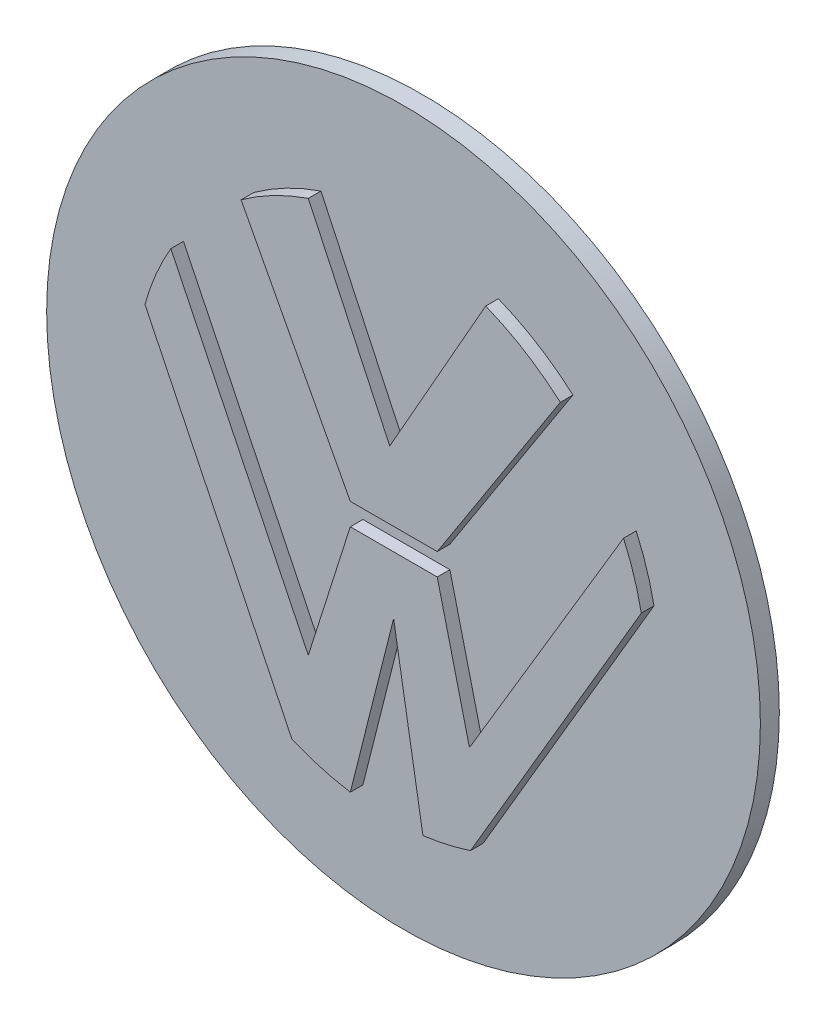
ISO-10303-21;
HEADER;
FILE_DESCRIPTION(('STEP AP214'),'2;1');
FILE_NAME('part.step','',(''),(''),'','','');
FILE_SCHEMA(('AUTOMOTIVE_DESIGN { 1 0 10303 214 1 1 1 1 }'));
ENDSEC;
DATA;
#1=APPLICATION_CONTEXT('core data for automotive mechanical design processes');
#2=APPLICATION_PROTOCOL_DEFINITION('international standard','automotive_design',2000,#1);
#3=PRODUCT_CONTEXT('',#1,'mechanical');
#4=PRODUCT('Part','Part','',(#3));
#5=PRODUCT_RELATED_PRODUCT_CATEGORY('part','',(#4));
#6=PRODUCT_DEFINITION_FORMATION('','',#4);
#7=PRODUCT_DEFINITION_CONTEXT('part definition',#1,'design');
#8=PRODUCT_DEFINITION('design','',#6,#7);
#9=PRODUCT_DEFINITION_SHAPE('','',#8);
#10=(LENGTH_UNIT() NAMED_UNIT(*) SI_UNIT(.MILLI.,.METRE.));
#11=(NAMED_UNIT(*) PLANE_ANGLE_UNIT() SI_UNIT($,.RADIAN.));
#12=(NAMED_UNIT(*) SI_UNIT($,.STERADIAN.) SOLID_ANGLE_UNIT());
#13=UNCERTAINTY_MEASURE_WITH_UNIT(LENGTH_MEASURE(1.E-05),#10,'distance_accuracy_value','');
#14=(GEOMETRIC_REPRESENTATION_CONTEXT(3) GLOBAL_UNCERTAINTY_ASSIGNED_CONTEXT((#13)) GLOBAL_UNIT_ASSIGNED_CONTEXT((#10,
#11,#12)) REPRESENTATION_CONTEXT('',''));
#15=CARTESIAN_POINT('',(0.,0.,0.));
#16=DIRECTION('',(0.,0.,1.));
#17=DIRECTION('',(1.,0.,0.));
#18=AXIS2_PLACEMENT_3D('',#15,#16,#17);
#19=CARTESIAN_POINT('',(0.,0.,3.81));
#20=DIRECTION('',(0.,0.,1.));
#21=DIRECTION('',(1.,0.,0.));
#22=AXIS2_PLACEMENT_3D('',#19,#20,#21);
#23=PLANE('',#22);
#24=CARTESIAN_POINT('',(0.,0.,3.81));
#25=DIRECTION('',(0.,0.,1.));
#26=DIRECTION('',(1.,0.,0.));
#27=AXIS2_PLACEMENT_3D('',#24,#25,#26);
#28=CIRCLE('',#27,51.2536647636642);
#29=CARTESIAN_POINT('',(34.0363055297971,38.320595736345,3.81));
#30=VERTEX_POINT('',#29);
#31=CARTESIAN_POINT('',(19.0523443786856,47.5809449820203,3.81));
#32=VERTEX_POINT('',#31);
#33=EDGE_CURVE('E12',#30,#32,#28,.T.);
#34=ORIENTED_EDGE('',*,*,#33,.F.);
#35=DIRECTION('',(0.5420922449111,0.840318985866227,0.));
#36=VECTOR('',#35,1.);
#37=CARTESIAN_POINT('',(6.5780640593809,-4.24352843752894,3.81));
#38=LINE('',#37,#36);
#39=CARTESIAN_POINT('',(9.31557671318919,0.,3.81));
#40=VERTEX_POINT('',#39);
#41=EDGE_CURVE('E273',#40,#30,#38,.T.);
#42=ORIENTED_EDGE('',*,*,#41,.F.);
#43=DIRECTION('',(1.,0.,0.));
#44=VECTOR('',#43,1.);
#45=CARTESIAN_POINT('',(0.,0.,3.81));
#46=LINE('',#45,#44);
#47=CARTESIAN_POINT('',(-8.15112962404055,0.,3.81));
#48=VERTEX_POINT('',#47);
#49=EDGE_CURVE('E110',#48,#40,#46,.T.);
#50=ORIENTED_EDGE('',*,*,#49,.F.);
#51=DIRECTION('',(0.467462243657378,-0.884013037661103,0.));
#52=VECTOR('',#51,1.);
#53=CARTESIAN_POINT('',(-6.36993704117462,-3.36839496066942,3.81));
#54=LINE('',#53,#52);
#55=CARTESIAN_POINT('',(-30.0911287040771,41.4905064444958,3.81));
#56=VERTEX_POINT('',#55);
#57=EDGE_CURVE('E118',#56,#48,#54,.T.);
#58=ORIENTED_EDGE('',*,*,#57,.F.);
#59=CARTESIAN_POINT('',(0.,0.,3.81));
#60=DIRECTION('',(0.,0.,1.));
#61=DIRECTION('',(1.,0.,0.));
#62=AXIS2_PLACEMENT_3D('',#59,#60,#61);
#63=CIRCLE('',#62,51.2536647636642);
#64=CARTESIAN_POINT('',(-16.5902934966743,48.4943327967329,3.81));
#65=VERTEX_POINT('',#64);
#66=EDGE_CURVE('E103',#56,#65,#63,.F.);
#67=ORIENTED_EDGE('',*,*,#66,.T.);
#68=DIRECTION('',(-0.424472625867111,0.905440771055445,0.));
#69=VECTOR('',#68,1.);
#70=CARTESIAN_POINT('',(5.03695672922229,2.36133639833751,3.81));
#71=LINE('',#70,#69);
#72=CARTESIAN_POINT('',(-0.226270451346261,13.5883041371379,3.81));
#73=VERTEX_POINT('',#72);
#74=EDGE_CURVE('E269',#73,#65,#71,.T.);
#75=ORIENTED_EDGE('',*,*,#74,.F.);
#76=DIRECTION('',(0.493324744152342,0.869845214280694,0.));
#77=VECTOR('',#76,1.);
#78=CARTESIAN_POINT('',(-6.00216416732404,3.40407241839464,3.81));
#79=LINE('',#78,#77);
#80=EDGE_CURVE('E271',#73,#32,#79,.T.);
#81=ORIENTED_EDGE('',*,*,#80,.T.);
#82=EDGE_LOOP('',(#34,#42,#50,#58,#67,#75,#81));
#83=FACE_BOUND('',#82,.T.);
#84=DIRECTION('',(-0.512164792370812,-0.858887201823245,0.));
#85=VECTOR('',#84,1.);
#86=CARTESIAN_POINT('',(25.2268894986552,-15.0430983193287,3.81));
#87=LINE('',#86,#85);
#88=CARTESIAN_POINT('',(46.739319117021,21.0326936026595,3.81));
#89=VERTEX_POINT('',#88);
#90=CARTESIAN_POINT('',(15.7846686376129,-30.8774601793024,3.81));
#91=VERTEX_POINT('',#90);
#92=EDGE_CURVE('E261',#89,#91,#87,.T.);
#93=ORIENTED_EDGE('',*,*,#92,.F.);
#94=CARTESIAN_POINT('',(0.,0.,3.81));
#95=DIRECTION('',(0.,0.,1.));
#96=DIRECTION('',(1.,0.,0.));
#97=AXIS2_PLACEMENT_3D('',#94,#95,#96);
#98=CIRCLE('',#97,51.2536647636642);
#99=CARTESIAN_POINT('',(50.311661027371,9.78135554884867,3.81));
#100=VERTEX_POINT('',#99);
#101=EDGE_CURVE('E260',#89,#100,#98,.F.);
#102=ORIENTED_EDGE('',*,*,#101,.T.);
#103=DIRECTION('',(-0.506156196153584,-0.862441827078983,0.));
#104=VECTOR('',#103,1.);
#105=CARTESIAN_POINT('',(33.1522527436333,-19.456637671984,3.81));
#106=LINE('',#105,#104);
#107=CARTESIAN_POINT('',(15.9928444598957,-48.6946308928167,3.81));
#108=VERTEX_POINT('',#107);
#109=EDGE_CURVE('E239',#100,#108,#106,.T.);
#110=ORIENTED_EDGE('',*,*,#109,.T.);
#111=CARTESIAN_POINT('',(0.,0.,3.81));
#112=DIRECTION('',(0.,0.,1.));
#113=DIRECTION('',(1.,0.,0.));
#114=AXIS2_PLACEMENT_3D('',#111,#112,#113);
#115=CIRCLE('',#114,51.2536647636642);
#116=CARTESIAN_POINT('',(6.43998879212408,-50.8474649915155,3.81));
#117=VERTEX_POINT('',#116);
#118=EDGE_CURVE('E250',#108,#117,#115,.F.);
#119=ORIENTED_EDGE('',*,*,#118,.T.);
#120=DIRECTION('',(0.166628779108101,-0.986019700600827,0.));
#121=VECTOR('',#120,1.);
#122=CARTESIAN_POINT('',(-2.09301927728356,-0.353702108194151,3.81));
#123=LINE('',#122,#121);
#124=CARTESIAN_POINT('',(0.554492373951687,-16.0202553870525,3.81));
#125=VERTEX_POINT('',#124);
#126=EDGE_CURVE('E648',#125,#117,#123,.T.);
#127=ORIENTED_EDGE('',*,*,#126,.F.);
#128=DIRECTION('',(0.244128032439279,0.969743009140734,0.));
#129=VECTOR('',#128,1.);
#130=CARTESIAN_POINT('',(4.3141039967473,-1.08605446034363,3.81));
#131=LINE('',#130,#129);
#132=CARTESIAN_POINT('',(-8.15112962404055,-50.6013560841818,3.81));
#133=VERTEX_POINT('',#132);
#134=EDGE_CURVE('E647',#133,#125,#131,.T.);
#135=ORIENTED_EDGE('',*,*,#134,.F.);
#136=CARTESIAN_POINT('',(0.,0.,3.81));
#137=DIRECTION('',(0.,0.,1.));
#138=DIRECTION('',(1.,0.,0.));
#139=AXIS2_PLACEMENT_3D('',#136,#137,#138);
#140=CIRCLE('',#139,51.2536647636642);
#141=CARTESIAN_POINT('',(-19.8788875711119,-47.2415916395836,3.81));
#142=VERTEX_POINT('',#141);
#143=EDGE_CURVE('E254',#133,#142,#140,.F.);
#144=ORIENTED_EDGE('',*,*,#143,.T.);
#145=DIRECTION('',(-0.436325868196127,0.899788717834857,0.));
#146=VECTOR('',#145,1.);
#147=CARTESIAN_POINT('',(-34.6414402585583,-16.7983396510578,3.81));
#148=LINE('',#147,#146);
#149=CARTESIAN_POINT('',(-49.4039929460048,13.644912337468,3.81));
#150=VERTEX_POINT('',#149);
#151=EDGE_CURVE('E642',#142,#150,#148,.T.);
#152=ORIENTED_EDGE('',*,*,#151,.T.);
#153=CARTESIAN_POINT('',(0.,0.,3.81));
#154=DIRECTION('',(0.,0.,1.));
#155=DIRECTION('',(1.,0.,0.));
#156=AXIS2_PLACEMENT_3D('',#153,#154,#155);
#157=CIRCLE('',#156,51.2536647636642);
#158=CARTESIAN_POINT('',(-44.2033042832683,25.9423599957072,3.81));
#159=VERTEX_POINT('',#158);
#160=EDGE_CURVE('E332',#150,#159,#157,.F.);
#161=ORIENTED_EDGE('',*,*,#160,.T.);
#162=DIRECTION('',(0.436325868196127,-0.899788717834857,0.));
#163=VECTOR('',#162,1.);
#164=CARTESIAN_POINT('',(-25.6028686746389,-12.415352272536,3.81));
#165=LINE('',#164,#163);
#166=CARTESIAN_POINT('',(-16.5902934966743,-31.0010334224922,3.81));
#167=VERTEX_POINT('',#166);
#168=EDGE_CURVE('E658',#159,#167,#165,.T.);
#169=ORIENTED_EDGE('',*,*,#168,.T.);
#170=DIRECTION('',(0.302653927207119,0.953100519539313,0.));
#171=VECTOR('',#170,1.);
#172=CARTESIAN_POINT('',(-6.12808639852928,1.94595362897913,3.81));
#173=LINE('',#172,#171);
#174=CARTESIAN_POINT('',(-8.15112962404055,-4.42489893876487,3.81));
#175=VERTEX_POINT('',#174);
#176=EDGE_CURVE('E661',#167,#175,#173,.T.);
#177=ORIENTED_EDGE('',*,*,#176,.T.);
#178=DIRECTION('',(1.,0.,0.));
#179=VECTOR('',#178,1.);
#180=CARTESIAN_POINT('',(0.,-4.42489893876487,3.81));
#181=LINE('',#180,#179);
#182=CARTESIAN_POINT('',(9.31557671318919,-4.42489893876487,3.81));
#183=VERTEX_POINT('',#182);
#184=EDGE_CURVE('E664',#175,#183,#181,.T.);
#185=ORIENTED_EDGE('',*,*,#184,.T.);
#186=DIRECTION('',(-0.237553933219546,0.971374350501352,0.));
#187=VECTOR('',#186,1.);
#188=CARTESIAN_POINT('',(7.76881905399512,1.8998993763784,3.81));
#189=LINE('',#188,#187);
#190=EDGE_CURVE('E264',#91,#183,#189,.T.);
#191=ORIENTED_EDGE('',*,*,#190,.F.);
#192=EDGE_LOOP('',(#93,#102,#110,#119,#127,#135,#144,#152,#161,#169,#177,#185,#191));
#193=FACE_BOUND('',#192,.T.);
#194=CARTESIAN_POINT('',(0.,0.,3.81));
#195=DIRECTION('',(0.,0.,1.));
#196=DIRECTION('',(1.,0.,0.));
#197=AXIS2_PLACEMENT_3D('',#194,#195,#196);
#198=CIRCLE('',#197,71.6904803923688);
#199=CARTESIAN_POINT('',(-71.6904803923688,0.,3.81));
#200=VERTEX_POINT('',#199);
#201=EDGE_CURVE('E649',#200,#200,#198,.T.);
#202=ORIENTED_EDGE('',*,*,#201,.T.);
#203=EDGE_LOOP('',(#202));
#204=FACE_BOUND('',#203,.T.);
#205=ADVANCED_FACE('F95',(#83,#193,#204),#23,.T.);
#206=CARTESIAN_POINT('',(6.5780640593809,-4.24352843752894,6.35));
#207=DIRECTION('',(-0.840318985866227,0.5420922449111,0.));
#208=DIRECTION('',(-0.5420922449111,-0.840318985866227,0.));
#209=AXIS2_PLACEMENT_3D('',#206,#207,#208);
#210=PLANE('',#209);
#211=DIRECTION('',(0.,0.,-1.));
#212=VECTOR('',#211,1.);
#213=CARTESIAN_POINT('',(9.31557671318919,0.,6.35));
#214=LINE('',#213,#212);
#215=CARTESIAN_POINT('',(9.31557671318919,0.,6.35));
#216=VERTEX_POINT('',#215);
#217=EDGE_CURVE('E351',#216,#40,#214,.T.);
#218=ORIENTED_EDGE('',*,*,#217,.T.);
#219=ORIENTED_EDGE('',*,*,#41,.T.);
#220=DIRECTION('',(0.,0.,-1.));
#221=VECTOR('',#220,1.);
#222=CARTESIAN_POINT('',(34.0363055297971,38.320595736345,6.35));
#223=LINE('',#222,#221);
#224=CARTESIAN_POINT('',(34.0363055297971,38.320595736345,6.35));
#225=VERTEX_POINT('',#224);
#226=EDGE_CURVE('E366',#225,#30,#223,.T.);
#227=ORIENTED_EDGE('',*,*,#226,.F.);
#228=DIRECTION('',(0.5420922449111,0.840318985866227,0.));
#229=VECTOR('',#228,1.);
#230=CARTESIAN_POINT('',(6.5780640593809,-4.24352843752894,6.35));
#231=LINE('',#230,#229);
#232=EDGE_CURVE('E336',#216,#225,#231,.T.);
#233=ORIENTED_EDGE('',*,*,#232,.F.);
#234=EDGE_LOOP('',(#218,#219,#227,#233));
#235=FACE_BOUND('',#234,.T.);
#236=ADVANCED_FACE('F395',(#235),#210,.F.);
#237=CARTESIAN_POINT('',(0.,0.,6.35));
#238=DIRECTION('',(0.,0.,-1.));
#239=DIRECTION('',(-1.,0.,0.));
#240=AXIS2_PLACEMENT_3D('',#237,#238,#239);
#241=CYLINDRICAL_SURFACE('',#240,51.2536647636642);
#242=ORIENTED_EDGE('',*,*,#33,.T.);
#243=DIRECTION('',(0.,0.,-1.));
#244=VECTOR('',#243,1.);
#245=CARTESIAN_POINT('',(19.0523443786856,47.5809449820203,6.35));
#246=LINE('',#245,#244);
#247=CARTESIAN_POINT('',(19.0523443786856,47.5809449820203,6.35));
#248=VERTEX_POINT('',#247);
#249=EDGE_CURVE('E363',#248,#32,#246,.T.);
#250=ORIENTED_EDGE('',*,*,#249,.F.);
#251=CARTESIAN_POINT('',(0.,0.,6.35));
#252=DIRECTION('',(0.,0.,1.));
#253=DIRECTION('',(1.,0.,0.));
#254=AXIS2_PLACEMENT_3D('',#251,#252,#253);
#255=CIRCLE('',#254,51.2536647636642);
#256=EDGE_CURVE('E339',#225,#248,#255,.T.);
#257=ORIENTED_EDGE('',*,*,#256,.F.);
#258=ORIENTED_EDGE('',*,*,#226,.T.);
#259=EDGE_LOOP('',(#242,#250,#257,#258));
#260=FACE_BOUND('',#259,.T.);
#261=ADVANCED_FACE('F391',(#260),#241,.T.);
#262=CARTESIAN_POINT('',(-6.00216416732404,3.40407241839464,6.35));
#263=DIRECTION('',(-0.869845214280694,0.493324744152342,0.));
#264=DIRECTION('',(-0.493324744152342,-0.869845214280694,0.));
#265=AXIS2_PLACEMENT_3D('',#262,#263,#264);
#266=PLANE('',#265);
#267=ORIENTED_EDGE('',*,*,#80,.F.);
#268=DIRECTION('',(0.,0.,-1.));
#269=VECTOR('',#268,1.);
#270=CARTESIAN_POINT('',(-0.22627045134626,13.5883041371379,6.35));
#271=LINE('',#270,#269);
#272=CARTESIAN_POINT('',(-0.22627045134626,13.5883041371379,6.35));
#273=VERTEX_POINT('',#272);
#274=EDGE_CURVE('E360',#273,#73,#271,.T.);
#275=ORIENTED_EDGE('',*,*,#274,.F.);
#276=DIRECTION('',(0.493324744152342,0.869845214280694,0.));
#277=VECTOR('',#276,1.);
#278=CARTESIAN_POINT('',(-6.00216416732404,3.40407241839464,6.35));
#279=LINE('',#278,#277);
#280=EDGE_CURVE('E341',#273,#248,#279,.T.);
#281=ORIENTED_EDGE('',*,*,#280,.T.);
#282=ORIENTED_EDGE('',*,*,#249,.T.);
#283=EDGE_LOOP('',(#267,#275,#281,#282));
#284=FACE_BOUND('',#283,.T.);
#285=ADVANCED_FACE('F387',(#284),#266,.T.);
#286=CARTESIAN_POINT('',(5.03695672922229,2.36133639833751,6.35));
#287=DIRECTION('',(-0.905440771055445,-0.424472625867111,0.));
#288=DIRECTION('',(0.424472625867111,-0.905440771055445,0.));
#289=AXIS2_PLACEMENT_3D('',#286,#287,#288);
#290=PLANE('',#289);
#291=ORIENTED_EDGE('',*,*,#274,.T.);
#292=ORIENTED_EDGE('',*,*,#74,.T.);
#293=DIRECTION('',(0.,0.,-1.));
#294=VECTOR('',#293,1.);
#295=CARTESIAN_POINT('',(-16.5902934966743,48.4943327967329,6.35));
#296=LINE('',#295,#294);
#297=CARTESIAN_POINT('',(-16.5902934966743,48.4943327967329,6.35));
#298=VERTEX_POINT('',#297);
#299=EDGE_CURVE('E357',#298,#65,#296,.T.);
#300=ORIENTED_EDGE('',*,*,#299,.F.);
#301=DIRECTION('',(-0.424472625867111,0.905440771055446,0.));
#302=VECTOR('',#301,1.);
#303=CARTESIAN_POINT('',(5.03695672922229,2.36133639833751,6.35));
#304=LINE('',#303,#302);
#305=EDGE_CURVE('E345',#273,#298,#304,.T.);
#306=ORIENTED_EDGE('',*,*,#305,.F.);
#307=EDGE_LOOP('',(#291,#292,#300,#306));
#308=FACE_BOUND('',#307,.T.);
#309=ADVANCED_FACE('F385',(#308),#290,.F.);
#310=ORIENTED_EDGE('',*,*,#66,.F.);
#311=DIRECTION('',(0.,0.,-1.));
#312=VECTOR('',#311,1.);
#313=CARTESIAN_POINT('',(-30.0911287040771,41.4905064444958,6.35));
#314=LINE('',#313,#312);
#315=CARTESIAN_POINT('',(-30.0911287040771,41.4905064444958,6.35));
#316=VERTEX_POINT('',#315);
#317=EDGE_CURVE('E355',#316,#56,#314,.T.);
#318=ORIENTED_EDGE('',*,*,#317,.F.);
#319=EDGE_CURVE('E342',#298,#316,#255,.T.);
#320=ORIENTED_EDGE('',*,*,#319,.F.);
#321=ORIENTED_EDGE('',*,*,#299,.T.);
#322=EDGE_LOOP('',(#310,#318,#320,#321));
#323=FACE_BOUND('',#322,.T.);
#324=ADVANCED_FACE('F374',(#323),#241,.T.);
#325=CARTESIAN_POINT('',(-6.36993704117462,-3.36839496066942,6.35));
#326=DIRECTION('',(0.884013037661103,0.467462243657378,0.));
#327=DIRECTION('',(-0.467462243657378,0.884013037661103,0.));
#328=AXIS2_PLACEMENT_3D('',#325,#326,#327);
#329=PLANE('',#328);
#330=ORIENTED_EDGE('',*,*,#317,.T.);
#331=ORIENTED_EDGE('',*,*,#57,.T.);
#332=DIRECTION('',(0.,0.,-1.));
#333=VECTOR('',#332,1.);
#334=CARTESIAN_POINT('',(-8.15112962404055,0.,6.35));
#335=LINE('',#334,#333);
#336=CARTESIAN_POINT('',(-8.15112962404055,0.,6.35));
#337=VERTEX_POINT('',#336);
#338=EDGE_CURVE('E353',#337,#48,#335,.T.);
#339=ORIENTED_EDGE('',*,*,#338,.F.);
#340=DIRECTION('',(0.467462243657378,-0.884013037661103,0.));
#341=VECTOR('',#340,1.);
#342=CARTESIAN_POINT('',(-6.36993704117462,-3.36839496066942,6.35));
#343=LINE('',#342,#341);
#344=EDGE_CURVE('E347',#316,#337,#343,.T.);
#345=ORIENTED_EDGE('',*,*,#344,.F.);
#346=EDGE_LOOP('',(#330,#331,#339,#345));
#347=FACE_BOUND('',#346,.T.);
#348=ADVANCED_FACE('F378',(#347),#329,.F.);
#349=CARTESIAN_POINT('',(0.,0.,6.35));
#350=DIRECTION('',(0.,1.,0.));
#351=DIRECTION('',(0.,0.,1.));
#352=AXIS2_PLACEMENT_3D('',#349,#350,#351);
#353=PLANE('',#352);
#354=ORIENTED_EDGE('',*,*,#338,.T.);
#355=ORIENTED_EDGE('',*,*,#49,.T.);
#356=ORIENTED_EDGE('',*,*,#217,.F.);
#357=DIRECTION('',(1.,0.,0.));
#358=VECTOR('',#357,1.);
#359=CARTESIAN_POINT('',(0.,0.,6.35));
#360=LINE('',#359,#358);
#361=EDGE_CURVE('E349',#337,#216,#360,.T.);
#362=ORIENTED_EDGE('',*,*,#361,.F.);
#363=EDGE_LOOP('',(#354,#355,#356,#362));
#364=FACE_BOUND('',#363,.T.);
#365=ADVANCED_FACE('F396',(#364),#353,.F.);
#366=CARTESIAN_POINT('',(0.,0.,6.35));
#367=DIRECTION('',(0.,0.,1.));
#368=DIRECTION('',(1.,0.,0.));
#369=AXIS2_PLACEMENT_3D('',#366,#367,#368);
#370=PLANE('',#369);
#371=ORIENTED_EDGE('',*,*,#232,.T.);
#372=ORIENTED_EDGE('',*,*,#256,.T.);
#373=ORIENTED_EDGE('',*,*,#280,.F.);
#374=ORIENTED_EDGE('',*,*,#305,.T.);
#375=ORIENTED_EDGE('',*,*,#319,.T.);
#376=ORIENTED_EDGE('',*,*,#344,.T.);
#377=ORIENTED_EDGE('',*,*,#361,.T.);
#378=EDGE_LOOP('',(#371,#372,#373,#374,#375,#376,#377));
#379=FACE_BOUND('',#378,.T.);
#380=ADVANCED_FACE('F381',(#379),#370,.T.);
#381=CARTESIAN_POINT('',(33.1522527436333,-19.456637671984,6.35));
#382=DIRECTION('',(0.862441827078983,-0.506156196153584,0.));
#383=DIRECTION('',(0.506156196153584,0.862441827078983,0.));
#384=AXIS2_PLACEMENT_3D('',#381,#382,#383);
#385=PLANE('',#384);
#386=ORIENTED_EDGE('',*,*,#109,.F.);
#387=DIRECTION('',(0.,0.,-1.));
#388=VECTOR('',#387,1.);
#389=CARTESIAN_POINT('',(50.311661027371,9.78135554884867,6.35));
#390=LINE('',#389,#388);
#391=CARTESIAN_POINT('',(50.311661027371,9.78135554884867,6.35));
#392=VERTEX_POINT('',#391);
#393=EDGE_CURVE('E255',#392,#100,#390,.T.);
#394=ORIENTED_EDGE('',*,*,#393,.F.);
#395=DIRECTION('',(-0.506156196153584,-0.862441827078983,0.));
#396=VECTOR('',#395,1.);
#397=CARTESIAN_POINT('',(33.1522527436333,-19.456637671984,6.35));
#398=LINE('',#397,#396);
#399=CARTESIAN_POINT('',(15.9928444598957,-48.6946308928167,6.35));
#400=VERTEX_POINT('',#399);
#401=EDGE_CURVE('E242',#392,#400,#398,.T.);
#402=ORIENTED_EDGE('',*,*,#401,.T.);
#403=DIRECTION('',(0.,0.,-1.));
#404=VECTOR('',#403,1.);
#405=CARTESIAN_POINT('',(15.9928444598957,-48.6946308928167,6.35));
#406=LINE('',#405,#404);
#407=EDGE_CURVE('E235',#400,#108,#406,.T.);
#408=ORIENTED_EDGE('',*,*,#407,.T.);
#409=EDGE_LOOP('',(#386,#394,#402,#408));
#410=FACE_BOUND('',#409,.T.);
#411=ADVANCED_FACE('F237',(#410),#385,.T.);
#412=CARTESIAN_POINT('',(0.,0.,6.35));
#413=DIRECTION('',(0.,0.,-1.));
#414=DIRECTION('',(-1.,0.,0.));
#415=AXIS2_PLACEMENT_3D('',#412,#413,#414);
#416=CYLINDRICAL_SURFACE('',#415,51.2536647636642);
#417=ORIENTED_EDGE('',*,*,#101,.F.);
#418=DIRECTION('',(0.,0.,-1.));
#419=VECTOR('',#418,1.);
#420=CARTESIAN_POINT('',(46.739319117021,21.0326936026595,6.35));
#421=LINE('',#420,#419);
#422=CARTESIAN_POINT('',(46.739319117021,21.0326936026595,6.35));
#423=VERTEX_POINT('',#422);
#424=EDGE_CURVE('E326',#423,#89,#421,.T.);
#425=ORIENTED_EDGE('',*,*,#424,.F.);
#426=CARTESIAN_POINT('',(0.,0.,6.35));
#427=DIRECTION('',(0.,0.,1.));
#428=DIRECTION('',(1.,0.,0.));
#429=AXIS2_PLACEMENT_3D('',#426,#427,#428);
#430=CIRCLE('',#429,51.2536647636642);
#431=EDGE_CURVE('E276',#392,#423,#430,.T.);
#432=ORIENTED_EDGE('',*,*,#431,.F.);
#433=ORIENTED_EDGE('',*,*,#393,.T.);
#434=EDGE_LOOP('',(#417,#425,#432,#433));
#435=FACE_BOUND('',#434,.T.);
#436=ADVANCED_FACE('F455',(#435),#416,.T.);
#437=CARTESIAN_POINT('',(25.2268894986552,-15.0430983193287,6.35));
#438=DIRECTION('',(0.858887201823245,-0.512164792370812,0.));
#439=DIRECTION('',(0.512164792370812,0.858887201823245,0.));
#440=AXIS2_PLACEMENT_3D('',#437,#438,#439);
#441=PLANE('',#440);
#442=ORIENTED_EDGE('',*,*,#424,.T.);
#443=ORIENTED_EDGE('',*,*,#92,.T.);
#444=DIRECTION('',(0.,0.,-1.));
#445=VECTOR('',#444,1.);
#446=CARTESIAN_POINT('',(15.7846686376129,-30.8774601793024,6.35));
#447=LINE('',#446,#445);
#448=CARTESIAN_POINT('',(15.7846686376129,-30.8774601793024,6.35));
#449=VERTEX_POINT('',#448);
#450=EDGE_CURVE('E323',#449,#91,#447,.T.);
#451=ORIENTED_EDGE('',*,*,#450,.F.);
#452=DIRECTION('',(-0.512164792370812,-0.858887201823245,0.));
#453=VECTOR('',#452,1.);
#454=CARTESIAN_POINT('',(25.2268894986552,-15.0430983193287,6.35));
#455=LINE('',#454,#453);
#456=EDGE_CURVE('E278',#423,#449,#455,.T.);
#457=ORIENTED_EDGE('',*,*,#456,.F.);
#458=EDGE_LOOP('',(#442,#443,#451,#457));
#459=FACE_BOUND('',#458,.T.);
#460=ADVANCED_FACE('F465',(#459),#441,.F.);
#461=CARTESIAN_POINT('',(7.76881905399512,1.8998993763784,6.35));
#462=DIRECTION('',(-0.971374350501352,-0.237553933219546,0.));
#463=DIRECTION('',(0.237553933219546,-0.971374350501352,0.));
#464=AXIS2_PLACEMENT_3D('',#461,#462,#463);
#465=PLANE('',#464);
#466=ORIENTED_EDGE('',*,*,#450,.T.);
#467=ORIENTED_EDGE('',*,*,#190,.T.);
#468=DIRECTION('',(0.,0.,-1.));
#469=VECTOR('',#468,1.);
#470=CARTESIAN_POINT('',(9.31557671318919,-4.42489893876487,6.35));
#471=LINE('',#470,#469);
#472=CARTESIAN_POINT('',(9.31557671318919,-4.42489893876487,6.35));
#473=VERTEX_POINT('',#472);
#474=EDGE_CURVE('E320',#473,#183,#471,.T.);
#475=ORIENTED_EDGE('',*,*,#474,.F.);
#476=DIRECTION('',(-0.237553933219546,0.971374350501352,0.));
#477=VECTOR('',#476,1.);
#478=CARTESIAN_POINT('',(7.76881905399512,1.8998993763784,6.35));
#479=LINE('',#478,#477);
#480=EDGE_CURVE('E281',#449,#473,#479,.T.);
#481=ORIENTED_EDGE('',*,*,#480,.F.);
#482=EDGE_LOOP('',(#466,#467,#475,#481));
#483=FACE_BOUND('',#482,.T.);
#484=ADVANCED_FACE('F476',(#483),#465,.F.);
#485=CARTESIAN_POINT('',(0.,-4.42489893876487,6.35));
#486=DIRECTION('',(0.,1.,0.));
#487=DIRECTION('',(0.,0.,1.));
#488=AXIS2_PLACEMENT_3D('',#485,#486,#487);
#489=PLANE('',#488);
#490=ORIENTED_EDGE('',*,*,#184,.F.);
#491=DIRECTION('',(0.,0.,-1.));
#492=VECTOR('',#491,1.);
#493=CARTESIAN_POINT('',(-8.15112962404055,-4.42489893876487,6.35));
#494=LINE('',#493,#492);
#495=CARTESIAN_POINT('',(-8.15112962404055,-4.42489893876487,6.35));
#496=VERTEX_POINT('',#495);
#497=EDGE_CURVE('E317',#496,#175,#494,.T.);
#498=ORIENTED_EDGE('',*,*,#497,.F.);
#499=DIRECTION('',(1.,0.,0.));
#500=VECTOR('',#499,1.);
#501=CARTESIAN_POINT('',(0.,-4.42489893876487,6.35));
#502=LINE('',#501,#500);
#503=EDGE_CURVE('E283',#496,#473,#502,.T.);
#504=ORIENTED_EDGE('',*,*,#503,.T.);
#505=ORIENTED_EDGE('',*,*,#474,.T.);
#506=EDGE_LOOP('',(#490,#498,#504,#505));
#507=FACE_BOUND('',#506,.T.);
#508=ADVANCED_FACE('F486',(#507),#489,.T.);
#509=CARTESIAN_POINT('',(-6.12808639852928,1.94595362897913,6.35));
#510=DIRECTION('',(-0.953100519539313,0.302653927207119,0.));
#511=DIRECTION('',(-0.302653927207119,-0.953100519539313,0.));
#512=AXIS2_PLACEMENT_3D('',#509,#510,#511);
#513=PLANE('',#512);
#514=ORIENTED_EDGE('',*,*,#176,.F.);
#515=DIRECTION('',(0.,0.,-1.));
#516=VECTOR('',#515,1.);
#517=CARTESIAN_POINT('',(-16.5902934966743,-31.0010334224922,6.35));
#518=LINE('',#517,#516);
#519=CARTESIAN_POINT('',(-16.5902934966743,-31.0010334224922,6.35));
#520=VERTEX_POINT('',#519);
#521=EDGE_CURVE('E315',#520,#167,#518,.T.);
#522=ORIENTED_EDGE('',*,*,#521,.F.);
#523=DIRECTION('',(0.302653927207119,0.953100519539313,0.));
#524=VECTOR('',#523,1.);
#525=CARTESIAN_POINT('',(-6.12808639852928,1.94595362897913,6.35));
#526=LINE('',#525,#524);
#527=EDGE_CURVE('E286',#520,#496,#526,.T.);
#528=ORIENTED_EDGE('',*,*,#527,.T.);
#529=ORIENTED_EDGE('',*,*,#497,.T.);
#530=EDGE_LOOP('',(#514,#522,#528,#529));
#531=FACE_BOUND('',#530,.T.);
#532=ADVANCED_FACE('F496',(#531),#513,.T.);
#533=CARTESIAN_POINT('',(-25.6028686746389,-12.415352272536,6.35));
#534=DIRECTION('',(0.899788717834857,0.436325868196127,0.));
#535=DIRECTION('',(-0.436325868196127,0.899788717834857,0.));
#536=AXIS2_PLACEMENT_3D('',#533,#534,#535);
#537=PLANE('',#536);
#538=ORIENTED_EDGE('',*,*,#168,.F.);
#539=DIRECTION('',(0.,0.,-1.));
#540=VECTOR('',#539,1.);
#541=CARTESIAN_POINT('',(-44.2033042832683,25.9423599957072,6.35));
#542=LINE('',#541,#540);
#543=CARTESIAN_POINT('',(-44.2033042832683,25.9423599957072,6.35));
#544=VERTEX_POINT('',#543);
#545=EDGE_CURVE('E312',#544,#159,#542,.T.);
#546=ORIENTED_EDGE('',*,*,#545,.F.);
#547=DIRECTION('',(0.436325868196127,-0.899788717834857,0.));
#548=VECTOR('',#547,1.);
#549=CARTESIAN_POINT('',(-25.6028686746389,-12.415352272536,6.35));
#550=LINE('',#549,#548);
#551=EDGE_CURVE('E289',#544,#520,#550,.T.);
#552=ORIENTED_EDGE('',*,*,#551,.T.);
#553=ORIENTED_EDGE('',*,*,#521,.T.);
#554=EDGE_LOOP('',(#538,#546,#552,#553));
#555=FACE_BOUND('',#554,.T.);
#556=ADVANCED_FACE('F506',(#555),#537,.T.);
#557=ORIENTED_EDGE('',*,*,#160,.F.);
#558=DIRECTION('',(0.,0.,-1.));
#559=VECTOR('',#558,1.);
#560=CARTESIAN_POINT('',(-49.4039929460048,13.644912337468,6.35));
#561=LINE('',#560,#559);
#562=CARTESIAN_POINT('',(-49.4039929460048,13.644912337468,6.35));
#563=VERTEX_POINT('',#562);
#564=EDGE_CURVE('E310',#563,#150,#561,.T.);
#565=ORIENTED_EDGE('',*,*,#564,.F.);
#566=EDGE_CURVE('E279',#544,#563,#430,.T.);
#567=ORIENTED_EDGE('',*,*,#566,.F.);
#568=ORIENTED_EDGE('',*,*,#545,.T.);
#569=EDGE_LOOP('',(#557,#565,#567,#568));
#570=FACE_BOUND('',#569,.T.);
#571=ADVANCED_FACE('F468',(#570),#416,.T.);
#572=CARTESIAN_POINT('',(-34.6414402585583,-16.7983396510578,6.35));
#573=DIRECTION('',(-0.899788717834857,-0.436325868196127,0.));
#574=DIRECTION('',(0.436325868196127,-0.899788717834857,0.));
#575=AXIS2_PLACEMENT_3D('',#572,#573,#574);
#576=PLANE('',#575);
#577=ORIENTED_EDGE('',*,*,#151,.F.);
#578=DIRECTION('',(0.,0.,-1.));
#579=VECTOR('',#578,1.);
#580=CARTESIAN_POINT('',(-19.8788875711119,-47.2415916395836,6.35));
#581=LINE('',#580,#579);
#582=CARTESIAN_POINT('',(-19.8788875711119,-47.2415916395836,6.35));
#583=VERTEX_POINT('',#582);
#584=EDGE_CURVE('E307',#583,#142,#581,.T.);
#585=ORIENTED_EDGE('',*,*,#584,.F.);
#586=DIRECTION('',(-0.436325868196127,0.899788717834857,0.));
#587=VECTOR('',#586,1.);
#588=CARTESIAN_POINT('',(-34.6414402585583,-16.7983396510578,6.35));
#589=LINE('',#588,#587);
#590=EDGE_CURVE('E292',#583,#563,#589,.T.);
#591=ORIENTED_EDGE('',*,*,#590,.T.);
#592=ORIENTED_EDGE('',*,*,#564,.T.);
#593=EDGE_LOOP('',(#577,#585,#591,#592));
#594=FACE_BOUND('',#593,.T.);
#595=ADVANCED_FACE('F525',(#594),#576,.T.);
#596=ORIENTED_EDGE('',*,*,#143,.F.);
#597=DIRECTION('',(0.,0.,-1.));
#598=VECTOR('',#597,1.);
#599=CARTESIAN_POINT('',(-8.15112962404055,-50.6013560841818,6.35));
#600=LINE('',#599,#598);
#601=CARTESIAN_POINT('',(-8.15112962404055,-50.6013560841818,6.35));
#602=VERTEX_POINT('',#601);
#603=EDGE_CURVE('E304',#602,#133,#600,.T.);
#604=ORIENTED_EDGE('',*,*,#603,.F.);
#605=EDGE_CURVE('E295',#583,#602,#430,.T.);
#606=ORIENTED_EDGE('',*,*,#605,.F.);
#607=ORIENTED_EDGE('',*,*,#584,.T.);
#608=EDGE_LOOP('',(#596,#604,#606,#607));
#609=FACE_BOUND('',#608,.T.);
#610=ADVANCED_FACE('F527',(#609),#416,.T.);
#611=CARTESIAN_POINT('',(4.3141039967473,-1.08605446034363,6.35));
#612=DIRECTION('',(-0.969743009140734,0.244128032439279,0.));
#613=DIRECTION('',(-0.244128032439279,-0.969743009140734,0.));
#614=AXIS2_PLACEMENT_3D('',#611,#612,#613);
#615=PLANE('',#614);
#616=ORIENTED_EDGE('',*,*,#603,.T.);
#617=ORIENTED_EDGE('',*,*,#134,.T.);
#618=DIRECTION('',(0.,0.,-1.));
#619=VECTOR('',#618,1.);
#620=CARTESIAN_POINT('',(0.554492373951687,-16.0202553870525,6.35));
#621=LINE('',#620,#619);
#622=CARTESIAN_POINT('',(0.554492373951687,-16.0202553870525,6.35));
#623=VERTEX_POINT('',#622);
#624=EDGE_CURVE('E301',#623,#125,#621,.T.);
#625=ORIENTED_EDGE('',*,*,#624,.F.);
#626=DIRECTION('',(0.244128032439279,0.969743009140734,0.));
#627=VECTOR('',#626,1.);
#628=CARTESIAN_POINT('',(4.3141039967473,-1.08605446034363,6.35));
#629=LINE('',#628,#627);
#630=EDGE_CURVE('E296',#602,#623,#629,.T.);
#631=ORIENTED_EDGE('',*,*,#630,.F.);
#632=EDGE_LOOP('',(#616,#617,#625,#631));
#633=FACE_BOUND('',#632,.T.);
#634=ADVANCED_FACE('F544',(#633),#615,.F.);
#635=CARTESIAN_POINT('',(-2.09301927728356,-0.353702108194151,6.35));
#636=DIRECTION('',(0.986019700600827,0.166628779108101,0.));
#637=DIRECTION('',(-0.166628779108101,0.986019700600827,0.));
#638=AXIS2_PLACEMENT_3D('',#635,#636,#637);
#639=PLANE('',#638);
#640=ORIENTED_EDGE('',*,*,#624,.T.);
#641=ORIENTED_EDGE('',*,*,#126,.T.);
#642=DIRECTION('',(0.,0.,-1.));
#643=VECTOR('',#642,1.);
#644=CARTESIAN_POINT('',(6.43998879212408,-50.8474649915155,6.35));
#645=LINE('',#644,#643);
#646=CARTESIAN_POINT('',(6.43998879212408,-50.8474649915155,6.35));
#647=VERTEX_POINT('',#646);
#648=EDGE_CURVE('E245',#647,#117,#645,.T.);
#649=ORIENTED_EDGE('',*,*,#648,.F.);
#650=DIRECTION('',(0.166628779108101,-0.986019700600827,0.));
#651=VECTOR('',#650,1.);
#652=CARTESIAN_POINT('',(-2.09301927728356,-0.353702108194151,6.35));
#653=LINE('',#652,#651);
#654=EDGE_CURVE('E298',#623,#647,#653,.T.);
#655=ORIENTED_EDGE('',*,*,#654,.F.);
#656=EDGE_LOOP('',(#640,#641,#649,#655));
#657=FACE_BOUND('',#656,.T.);
#658=ADVANCED_FACE('F553',(#657),#639,.F.);
#659=ORIENTED_EDGE('',*,*,#118,.F.);
#660=ORIENTED_EDGE('',*,*,#407,.F.);
#661=EDGE_CURVE('E246',#647,#400,#430,.T.);
#662=ORIENTED_EDGE('',*,*,#661,.F.);
#663=ORIENTED_EDGE('',*,*,#648,.T.);
#664=EDGE_LOOP('',(#659,#660,#662,#663));
#665=FACE_BOUND('',#664,.T.);
#666=ADVANCED_FACE('F251',(#665),#416,.T.);
#667=CARTESIAN_POINT('',(0.,0.,6.35));
#668=DIRECTION('',(0.,0.,1.));
#669=DIRECTION('',(1.,0.,0.));
#670=AXIS2_PLACEMENT_3D('',#667,#668,#669);
#671=PLANE('',#670);
#672=ORIENTED_EDGE('',*,*,#401,.F.);
#673=ORIENTED_EDGE('',*,*,#431,.T.);
#674=ORIENTED_EDGE('',*,*,#456,.T.);
#675=ORIENTED_EDGE('',*,*,#480,.T.);
#676=ORIENTED_EDGE('',*,*,#503,.F.);
#677=ORIENTED_EDGE('',*,*,#527,.F.);
#678=ORIENTED_EDGE('',*,*,#551,.F.);
#679=ORIENTED_EDGE('',*,*,#566,.T.);
#680=ORIENTED_EDGE('',*,*,#590,.F.);
#681=ORIENTED_EDGE('',*,*,#605,.T.);
#682=ORIENTED_EDGE('',*,*,#630,.T.);
#683=ORIENTED_EDGE('',*,*,#654,.T.);
#684=ORIENTED_EDGE('',*,*,#661,.T.);
#685=EDGE_LOOP('',(#672,#673,#674,#675,#676,#677,#678,#679,#680,#681,#682,#683,#684));
#686=FACE_BOUND('',#685,.T.);
#687=ADVANCED_FACE('F572',(#686),#671,.T.);
#688=CARTESIAN_POINT('',(0.,0.,3.81));
#689=DIRECTION('',(0.,0.,-1.));
#690=DIRECTION('',(-1.,0.,0.));
#691=AXIS2_PLACEMENT_3D('',#688,#689,#690);
#692=CYLINDRICAL_SURFACE('',#691,71.6904803923688);
#693=CARTESIAN_POINT('',(0.,0.,0.));
#694=DIRECTION('',(0.,0.,1.));
#695=DIRECTION('',(1.,0.,0.));
#696=AXIS2_PLACEMENT_3D('',#693,#694,#695);
#697=CIRCLE('',#696,71.6904803923688);
#698=CARTESIAN_POINT('',(-71.6904803923688,0.,0.));
#699=VERTEX_POINT('',#698);
#700=EDGE_CURVE('E653',#699,#699,#697,.T.);
#701=CARTESIAN_POINT('',(-71.6904803923688,0.,3.81));
#702=CARTESIAN_POINT('',(-71.6904803923688,0.,3.7703125));
#703=CARTESIAN_POINT('',(-71.6904803923688,0.,3.730625));
#704=CARTESIAN_POINT('',(-71.6904803923688,0.,3.65125));
#705=CARTESIAN_POINT('',(-71.6904803923688,0.,3.6115625));
#706=CARTESIAN_POINT('',(-71.6904803923688,0.,3.5321875));
#707=CARTESIAN_POINT('',(-71.6904803923688,0.,3.4925));
#708=CARTESIAN_POINT('',(-71.6904803923688,0.,3.413125));
#709=CARTESIAN_POINT('',(-71.6904803923688,0.,3.3734375));
#710=CARTESIAN_POINT('',(-71.6904803923688,0.,3.2940625));
#711=CARTESIAN_POINT('',(-71.6904803923688,0.,3.254375));
#712=CARTESIAN_POINT('',(-71.6904803923688,0.,3.175));
#713=CARTESIAN_POINT('',(-71.6904803923688,0.,3.1353125));
#714=CARTESIAN_POINT('',(-71.6904803923688,0.,3.0559375));
#715=CARTESIAN_POINT('',(-71.6904803923688,0.,3.01625));
#716=CARTESIAN_POINT('',(-71.6904803923688,0.,2.936875));
#717=CARTESIAN_POINT('',(-71.6904803923688,0.,2.8971875));
#718=CARTESIAN_POINT('',(-71.6904803923688,0.,2.8178125));
#719=CARTESIAN_POINT('',(-71.6904803923688,0.,2.778125));
#720=CARTESIAN_POINT('',(-71.6904803923688,0.,2.69875));
#721=CARTESIAN_POINT('',(-71.6904803923688,0.,2.6590625));
#722=CARTESIAN_POINT('',(-71.6904803923688,0.,2.5796875));
#723=CARTESIAN_POINT('',(-71.6904803923688,0.,2.54));
#724=CARTESIAN_POINT('',(-71.6904803923688,0.,2.460625));
#725=CARTESIAN_POINT('',(-71.6904803923688,0.,2.4209375));
#726=CARTESIAN_POINT('',(-71.6904803923688,0.,2.3415625));
#727=CARTESIAN_POINT('',(-71.6904803923688,0.,2.301875));
#728=CARTESIAN_POINT('',(-71.6904803923688,0.,2.2225));
#729=CARTESIAN_POINT('',(-71.6904803923688,0.,2.1828125));
#730=CARTESIAN_POINT('',(-71.6904803923688,0.,2.1034375));
#731=CARTESIAN_POINT('',(-71.6904803923688,0.,2.06375));
#732=CARTESIAN_POINT('',(-71.6904803923688,0.,1.984375));
#733=CARTESIAN_POINT('',(-71.6904803923688,0.,1.9446875));
#734=CARTESIAN_POINT('',(-71.6904803923688,0.,1.8653125));
#735=CARTESIAN_POINT('',(-71.6904803923688,0.,1.825625));
#736=CARTESIAN_POINT('',(-71.6904803923688,0.,1.74625));
#737=CARTESIAN_POINT('',(-71.6904803923688,0.,1.7065625));
#738=CARTESIAN_POINT('',(-71.6904803923688,0.,1.6271875));
#739=CARTESIAN_POINT('',(-71.6904803923688,0.,1.5875));
#740=CARTESIAN_POINT('',(-71.6904803923688,0.,1.508125));
#741=CARTESIAN_POINT('',(-71.6904803923688,0.,1.4684375));
#742=CARTESIAN_POINT('',(-71.6904803923688,0.,1.3890625));
#743=CARTESIAN_POINT('',(-71.6904803923688,0.,1.349375));
#744=CARTESIAN_POINT('',(-71.6904803923688,0.,1.27));
#745=CARTESIAN_POINT('',(-71.6904803923688,0.,1.2303125));
#746=CARTESIAN_POINT('',(-71.6904803923688,0.,1.1509375));
#747=CARTESIAN_POINT('',(-71.6904803923688,0.,1.11125));
#748=CARTESIAN_POINT('',(-71.6904803923688,0.,1.031875));
#749=CARTESIAN_POINT('',(-71.6904803923688,0.,0.9921875));
#750=CARTESIAN_POINT('',(-71.6904803923688,0.,0.9128125));
#751=CARTESIAN_POINT('',(-71.6904803923688,0.,0.873125));
#752=CARTESIAN_POINT('',(-71.6904803923688,0.,0.79375));
#753=CARTESIAN_POINT('',(-71.6904803923688,0.,0.7540625));
#754=CARTESIAN_POINT('',(-71.6904803923688,0.,0.6746875));
#755=CARTESIAN_POINT('',(-71.6904803923688,0.,0.635));
#756=CARTESIAN_POINT('',(-71.6904803923688,0.,0.555625));
#757=CARTESIAN_POINT('',(-71.6904803923688,0.,0.5159375));
#758=CARTESIAN_POINT('',(-71.6904803923688,0.,0.4365625));
#759=CARTESIAN_POINT('',(-71.6904803923688,0.,0.396875));
#760=CARTESIAN_POINT('',(-71.6904803923688,0.,0.3175));
#761=CARTESIAN_POINT('',(-71.6904803923688,0.,0.2778125));
#762=CARTESIAN_POINT('',(-71.6904803923688,0.,0.1984375));
#763=CARTESIAN_POINT('',(-71.6904803923688,0.,0.15875));
#764=CARTESIAN_POINT('',(-71.6904803923688,0.,0.0793749999999999));
#765=CARTESIAN_POINT('',(-71.6904803923688,0.,0.0396874999999999));
#766=CARTESIAN_POINT('',(-71.6904803923688,0.,0.));
#767=B_SPLINE_CURVE_WITH_KNOTS('',3,(#701,#702,#703,#704,#705,#706,#707,#708,#709,#710,#711,
#712,#713,#714,#715,#716,#717,#718,#719,#720,#721,#722,#723,#724,#725,#726,#727,#728,#729,#730,
#731,#732,#733,#734,#735,#736,#737,#738,#739,#740,#741,#742,#743,#744,#745,#746,#747,#748,#749,
#750,#751,#752,#753,#754,#755,#756,#757,#758,#759,#760,#761,#762,#763,#764,#765,#766),
.UNSPECIFIED.,.F.,.F.,(4,2,2,2,2,2,2,2,2,2,2,2,2,2,2,2,2,2,2,2,2,2,2,2,2,2,2,2,2,2,2,2,4),(0.,
0.1190625,0.238125,0.3571875,0.47625,0.5953125,0.714375,0.8334375,0.9525,1.0715625,1.190625,
1.3096875,1.42875,1.5478125,1.666875,1.7859375,1.905,2.0240625,2.143125,2.2621875,2.38125,
2.5003125,2.619375,2.7384375,2.8575,2.9765625,3.095625,3.2146875,3.33375,3.4528125,3.571875,
3.6909375,3.81),.UNSPECIFIED.);
#768=EDGE_CURVE('BSEAM578',#200,#699,#767,.T.);
#769=ORIENTED_EDGE('',*,*,#201,.F.);
#770=ORIENTED_EDGE('',*,*,#700,.T.);
#771=ORIENTED_EDGE('',*,*,#768,.T.);
#772=ORIENTED_EDGE('',*,*,#768,.F.);
#773=EDGE_LOOP('',(#769,#771,#770,#772));
#774=FACE_BOUND('',#773,.T.);
#775=ADVANCED_FACE('F578',(#774),#692,.T.);
#776=CARTESIAN_POINT('',(0.,0.,0.));
#777=DIRECTION('',(0.,0.,1.));
#778=DIRECTION('',(1.,0.,0.));
#779=AXIS2_PLACEMENT_3D('',#776,#777,#778);
#780=PLANE('',#779);
#781=ORIENTED_EDGE('',*,*,#700,.F.);
#782=EDGE_LOOP('',(#781));
#783=FACE_BOUND('',#782,.T.);
#784=ADVANCED_FACE('F97',(#783),#780,.F.);
#785=CLOSED_SHELL('',(#205,#236,#261,#285,#309,#324,#348,#365,#380,#411,#436,#460,#484,#508,
#532,#556,#571,#595,#610,#634,#658,#666,#687,#775,#784));
#786=MANIFOLD_SOLID_BREP('B2',#785);
#787=ADVANCED_BREP_SHAPE_REPRESENTATION('',(#18,#786),#14);
#788=SHAPE_DEFINITION_REPRESENTATION(#9,#787);
ENDSEC;
END-ISO-10303-21;
